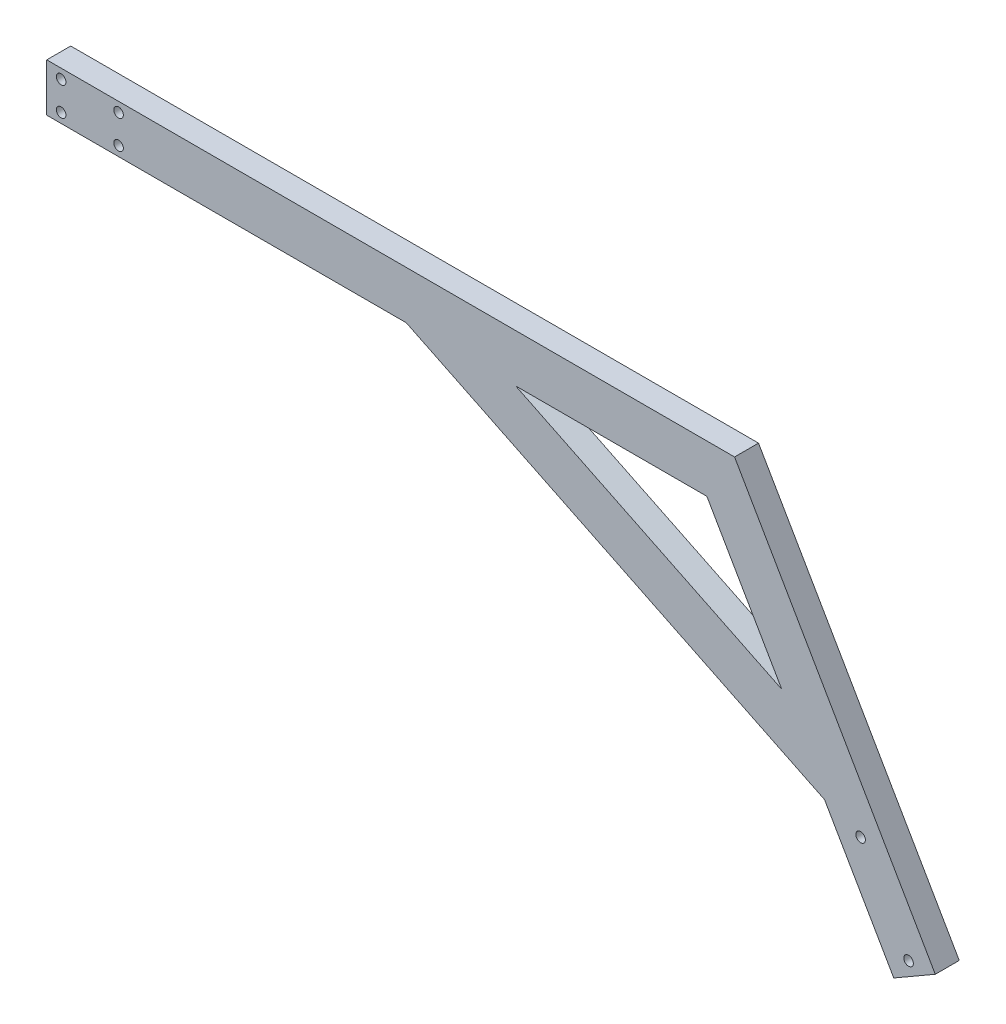
ISO-10303-21;
HEADER;
FILE_DESCRIPTION(('STEP AP214'),'2;1');
FILE_NAME('part.step','',(''),(''),'','','');
FILE_SCHEMA(('AUTOMOTIVE_DESIGN { 1 0 10303 214 1 1 1 1 }'));
ENDSEC;
DATA;
#1=APPLICATION_CONTEXT('core data for automotive mechanical design processes');
#2=APPLICATION_PROTOCOL_DEFINITION('international standard','automotive_design',2000,#1);
#3=PRODUCT_CONTEXT('',#1,'mechanical');
#4=PRODUCT('Part','Part','',(#3));
#5=PRODUCT_RELATED_PRODUCT_CATEGORY('part','',(#4));
#6=PRODUCT_DEFINITION_FORMATION('','',#4);
#7=PRODUCT_DEFINITION_CONTEXT('part definition',#1,'design');
#8=PRODUCT_DEFINITION('design','',#6,#7);
#9=PRODUCT_DEFINITION_SHAPE('','',#8);
#10=(LENGTH_UNIT() NAMED_UNIT(*) SI_UNIT(.MILLI.,.METRE.));
#11=(NAMED_UNIT(*) PLANE_ANGLE_UNIT() SI_UNIT($,.RADIAN.));
#12=(NAMED_UNIT(*) SI_UNIT($,.STERADIAN.) SOLID_ANGLE_UNIT());
#13=UNCERTAINTY_MEASURE_WITH_UNIT(LENGTH_MEASURE(1.E-05),#10,'distance_accuracy_value','');
#14=(GEOMETRIC_REPRESENTATION_CONTEXT(3) GLOBAL_UNCERTAINTY_ASSIGNED_CONTEXT((#13)) GLOBAL_UNIT_ASSIGNED_CONTEXT((#10,
#11,#12)) REPRESENTATION_CONTEXT('',''));
#15=CARTESIAN_POINT('',(0.,0.,0.));
#16=DIRECTION('',(0.,0.,1.));
#17=DIRECTION('',(1.,0.,0.));
#18=AXIS2_PLACEMENT_3D('',#15,#16,#17);
#19=CARTESIAN_POINT('',(0.,0.,-10.));
#20=DIRECTION('',(0.,1.,0.));
#21=DIRECTION('',(0.,0.,-1.));
#22=AXIS2_PLACEMENT_3D('',#19,#20,#21);
#23=PLANE('',#22);
#24=DIRECTION('',(0.,0.,1.));
#25=VECTOR('',#24,1.);
#26=CARTESIAN_POINT('',(150.,0.,-10.));
#27=LINE('',#26,#25);
#28=CARTESIAN_POINT('',(150.,0.,-10.));
#29=VERTEX_POINT('',#28);
#30=CARTESIAN_POINT('',(150.,0.,0.));
#31=VERTEX_POINT('',#30);
#32=EDGE_CURVE('E145',#29,#31,#27,.T.);
#33=ORIENTED_EDGE('',*,*,#32,.T.);
#34=DIRECTION('',(1.,0.,0.));
#35=VECTOR('',#34,1.);
#36=CARTESIAN_POINT('',(0.,0.,0.));
#37=LINE('',#36,#35);
#38=CARTESIAN_POINT('',(0.,0.,0.));
#39=VERTEX_POINT('',#38);
#40=EDGE_CURVE('E128',#39,#31,#37,.T.);
#41=ORIENTED_EDGE('',*,*,#40,.F.);
#42=DIRECTION('',(0.,0.,1.));
#43=VECTOR('',#42,1.);
#44=CARTESIAN_POINT('',(0.,0.,-10.));
#45=LINE('',#44,#43);
#46=CARTESIAN_POINT('',(0.,0.,-10.));
#47=VERTEX_POINT('',#46);
#48=EDGE_CURVE('E11',#47,#39,#45,.T.);
#49=ORIENTED_EDGE('',*,*,#48,.F.);
#50=DIRECTION('',(1.,0.,0.));
#51=VECTOR('',#50,1.);
#52=CARTESIAN_POINT('',(0.,0.,-10.));
#53=LINE('',#52,#51);
#54=EDGE_CURVE('E195',#47,#29,#53,.T.);
#55=ORIENTED_EDGE('',*,*,#54,.T.);
#56=EDGE_LOOP('',(#33,#41,#49,#55));
#57=FACE_BOUND('',#56,.T.);
#58=ADVANCED_FACE('F41',(#57),#23,.F.);
#59=DIRECTION('',(0.,0.,1.));
#60=VECTOR('',#59,1.);
#61=CARTESIAN_POINT('',(195.652685925849,0.,-10.));
#62=LINE('',#61,#60);
#63=CARTESIAN_POINT('',(195.652685925849,0.,-10.));
#64=VERTEX_POINT('',#63);
#65=CARTESIAN_POINT('',(195.652685925849,0.,0.));
#66=VERTEX_POINT('',#65);
#67=EDGE_CURVE('E151',#64,#66,#62,.T.);
#68=ORIENTED_EDGE('',*,*,#67,.F.);
#69=CARTESIAN_POINT('',(275.4,0.,-10.));
#70=VERTEX_POINT('',#69);
#71=EDGE_CURVE('E193',#64,#70,#53,.T.);
#72=ORIENTED_EDGE('',*,*,#71,.T.);
#73=DIRECTION('',(0.,0.,1.));
#74=VECTOR('',#73,1.);
#75=CARTESIAN_POINT('',(275.4,0.,-10.));
#76=LINE('',#75,#74);
#77=CARTESIAN_POINT('',(275.4,0.,0.));
#78=VERTEX_POINT('',#77);
#79=EDGE_CURVE('E49',#70,#78,#76,.T.);
#80=ORIENTED_EDGE('',*,*,#79,.T.);
#81=EDGE_CURVE('E212',#66,#78,#37,.T.);
#82=ORIENTED_EDGE('',*,*,#81,.F.);
#83=EDGE_LOOP('',(#68,#72,#80,#82));
#84=FACE_BOUND('',#83,.T.);
#85=ADVANCED_FACE('F233',(#84),#23,.F.);
#86=CARTESIAN_POINT('',(275.4,0.,-10.));
#87=DIRECTION('',(0.86602540378444,0.499999999999998,0.));
#88=DIRECTION('',(-0.499999999999998,0.86602540378444,0.));
#89=AXIS2_PLACEMENT_3D('',#86,#87,#88);
#90=PLANE('',#89);
#91=DIRECTION('',(0.,0.,1.));
#92=VECTOR('',#91,1.);
#93=CARTESIAN_POINT('',(324.498526901566,-85.0411431702995,-10.));
#94=LINE('',#93,#92);
#95=CARTESIAN_POINT('',(324.498526901566,-85.0411431702995,-10.));
#96=VERTEX_POINT('',#95);
#97=CARTESIAN_POINT('',(324.498526901566,-85.0411431702995,0.));
#98=VERTEX_POINT('',#97);
#99=EDGE_CURVE('E139',#96,#98,#94,.T.);
#100=ORIENTED_EDGE('',*,*,#99,.F.);
#101=DIRECTION('',(0.499999999999998,-0.86602540378444,0.));
#102=VECTOR('',#101,1.);
#103=CARTESIAN_POINT('',(275.4,0.,-10.));
#104=LINE('',#103,#102);
#105=CARTESIAN_POINT('',(353.366040361047,-135.0411431703,-10.));
#106=VERTEX_POINT('',#105);
#107=EDGE_CURVE('E197',#96,#106,#104,.T.);
#108=ORIENTED_EDGE('',*,*,#107,.T.);
#109=DIRECTION('',(0.,0.,1.));
#110=VECTOR('',#109,1.);
#111=CARTESIAN_POINT('',(353.366040361047,-135.0411431703,-10.));
#112=LINE('',#111,#110);
#113=CARTESIAN_POINT('',(353.366040361047,-135.0411431703,0.));
#114=VERTEX_POINT('',#113);
#115=EDGE_CURVE('E141',#106,#114,#112,.T.);
#116=ORIENTED_EDGE('',*,*,#115,.T.);
#117=DIRECTION('',(0.499999999999998,-0.86602540378444,0.));
#118=VECTOR('',#117,1.);
#119=CARTESIAN_POINT('',(275.4,0.,0.));
#120=LINE('',#119,#118);
#121=EDGE_CURVE('E125',#98,#114,#120,.T.);
#122=ORIENTED_EDGE('',*,*,#121,.F.);
#123=EDGE_LOOP('',(#100,#108,#116,#122));
#124=FACE_BOUND('',#123,.T.);
#125=ADVANCED_FACE('F137',(#124),#90,.F.);
#126=DIRECTION('',(0.,0.,1.));
#127=VECTOR('',#126,1.);
#128=CARTESIAN_POINT('',(306.623888719277,-54.0813616716643,-10.));
#129=LINE('',#128,#127);
#130=CARTESIAN_POINT('',(306.623888719277,-54.0813616716644,-10.));
#131=VERTEX_POINT('',#130);
#132=CARTESIAN_POINT('',(306.623888719277,-54.0813616716641,0.));
#133=VERTEX_POINT('',#132);
#134=EDGE_CURVE('E146',#131,#133,#129,.T.);
#135=ORIENTED_EDGE('',*,*,#134,.T.);
#136=EDGE_CURVE('E142',#78,#133,#120,.T.);
#137=ORIENTED_EDGE('',*,*,#136,.F.);
#138=ORIENTED_EDGE('',*,*,#79,.F.);
#139=EDGE_CURVE('E198',#70,#131,#104,.T.);
#140=ORIENTED_EDGE('',*,*,#139,.T.);
#141=EDGE_LOOP('',(#135,#137,#138,#140));
#142=FACE_BOUND('',#141,.T.);
#143=ADVANCED_FACE('F236',(#142),#90,.F.);
#144=CARTESIAN_POINT('',(0.,0.,-10.));
#145=DIRECTION('',(0.,0.,-1.));
#146=DIRECTION('',(1.,0.,0.));
#147=AXIS2_PLACEMENT_3D('',#144,#145,#146);
#148=PLANE('',#147);
#149=ORIENTED_EDGE('',*,*,#54,.F.);
#150=DIRECTION('',(0.,-1.,0.));
#151=VECTOR('',#150,1.);
#152=CARTESIAN_POINT('',(0.,20.,-10.));
#153=LINE('',#152,#151);
#154=CARTESIAN_POINT('',(0.,20.,-10.));
#155=VERTEX_POINT('',#154);
#156=EDGE_CURVE('E191',#155,#47,#153,.T.);
#157=ORIENTED_EDGE('',*,*,#156,.F.);
#158=DIRECTION('',(-1.,0.,0.));
#159=VECTOR('',#158,1.);
#160=CARTESIAN_POINT('',(286.947005383792,20.,-10.));
#161=LINE('',#160,#159);
#162=CARTESIAN_POINT('',(286.947005383792,20.,-10.));
#163=VERTEX_POINT('',#162);
#164=EDGE_CURVE('E207',#163,#155,#161,.T.);
#165=ORIENTED_EDGE('',*,*,#164,.F.);
#166=DIRECTION('',(-0.499999999999999,0.866025403784439,0.));
#167=VECTOR('',#166,1.);
#168=CARTESIAN_POINT('',(370.686548436736,-125.0411431703,-10.));
#169=LINE('',#168,#167);
#170=CARTESIAN_POINT('',(370.686548436736,-125.0411431703,-10.));
#171=VERTEX_POINT('',#170);
#172=EDGE_CURVE('E204',#171,#163,#169,.T.);
#173=ORIENTED_EDGE('',*,*,#172,.F.);
#174=DIRECTION('',(0.86602540378444,0.499999999999998,0.));
#175=VECTOR('',#174,1.);
#176=CARTESIAN_POINT('',(353.366040361047,-135.0411431703,-10.));
#177=LINE('',#176,#175);
#178=EDGE_CURVE('E201',#106,#171,#177,.T.);
#179=ORIENTED_EDGE('',*,*,#178,.F.);
#180=ORIENTED_EDGE('',*,*,#107,.F.);
#181=DIRECTION('',(0.898930958092636,-0.438090324685053,0.));
#182=VECTOR('',#181,1.);
#183=CARTESIAN_POINT('',(150.,0.,-10.));
#184=LINE('',#183,#182);
#185=EDGE_CURVE('E64',#29,#96,#184,.T.);
#186=ORIENTED_EDGE('',*,*,#185,.F.);
#187=EDGE_LOOP('',(#149,#157,#165,#173,#179,#180,#186));
#188=FACE_BOUND('',#187,.T.);
#189=CARTESIAN_POINT('',(339.526294398891,-91.07,-10.));
#190=DIRECTION('',(0.,0.,1.));
#191=DIRECTION('',(1.,0.,0.));
#192=AXIS2_PLACEMENT_3D('',#189,#190,#191);
#193=CIRCLE('',#192,2.);
#194=CARTESIAN_POINT('',(341.526294398891,-91.07,-10.));
#195=VERTEX_POINT('',#194);
#196=EDGE_CURVE('E161',#195,#195,#193,.T.);
#197=ORIENTED_EDGE('',*,*,#196,.T.);
#198=EDGE_LOOP('',(#197));
#199=FACE_BOUND('',#198,.T.);
#200=CARTESIAN_POINT('',(29.96,4.02,-10.));
#201=DIRECTION('',(0.,0.,1.));
#202=DIRECTION('',(1.,0.,0.));
#203=AXIS2_PLACEMENT_3D('',#200,#201,#202);
#204=CIRCLE('',#203,2.00000000000001);
#205=CARTESIAN_POINT('',(31.96,4.02,-10.));
#206=VERTEX_POINT('',#205);
#207=EDGE_CURVE('E173',#206,#206,#204,.T.);
#208=ORIENTED_EDGE('',*,*,#207,.T.);
#209=EDGE_LOOP('',(#208));
#210=FACE_BOUND('',#209,.T.);
#211=CARTESIAN_POINT('',(6.,15.98,-10.));
#212=DIRECTION('',(0.,0.,1.));
#213=DIRECTION('',(1.,0.,0.));
#214=AXIS2_PLACEMENT_3D('',#211,#212,#213);
#215=CIRCLE('',#214,2.);
#216=CARTESIAN_POINT('',(8.,15.98,-10.));
#217=VERTEX_POINT('',#216);
#218=EDGE_CURVE('E185',#217,#217,#215,.T.);
#219=ORIENTED_EDGE('',*,*,#218,.T.);
#220=EDGE_LOOP('',(#219));
#221=FACE_BOUND('',#220,.T.);
#222=DIRECTION('',(-0.898930958092636,0.438090324685053,0.));
#223=VECTOR('',#222,1.);
#224=CARTESIAN_POINT('',(195.652685925849,0.,-10.));
#225=LINE('',#224,#223);
#226=EDGE_CURVE('E56',#131,#64,#225,.T.);
#227=ORIENTED_EDGE('',*,*,#226,.F.);
#228=ORIENTED_EDGE('',*,*,#139,.F.);
#229=ORIENTED_EDGE('',*,*,#71,.F.);
#230=EDGE_LOOP('',(#227,#228,#229));
#231=FACE_BOUND('',#230,.T.);
#232=CARTESIAN_POINT('',(29.96,15.98,-10.));
#233=DIRECTION('',(0.,0.,1.));
#234=DIRECTION('',(1.,0.,0.));
#235=AXIS2_PLACEMENT_3D('',#232,#233,#234);
#236=CIRCLE('',#235,2.00000000000001);
#237=CARTESIAN_POINT('',(31.96,15.98,-10.));
#238=VERTEX_POINT('',#237);
#239=EDGE_CURVE('E179',#238,#238,#236,.T.);
#240=ORIENTED_EDGE('',*,*,#239,.T.);
#241=EDGE_LOOP('',(#240));
#242=FACE_BOUND('',#241,.T.);
#243=CARTESIAN_POINT('',(6.,4.02,-10.));
#244=DIRECTION('',(0.,0.,1.));
#245=DIRECTION('',(1.,0.,0.));
#246=AXIS2_PLACEMENT_3D('',#243,#244,#245);
#247=CIRCLE('',#246,2.);
#248=CARTESIAN_POINT('',(8.,4.02,-10.));
#249=VERTEX_POINT('',#248);
#250=EDGE_CURVE('E167',#249,#249,#247,.T.);
#251=ORIENTED_EDGE('',*,*,#250,.T.);
#252=EDGE_LOOP('',(#251));
#253=FACE_BOUND('',#252,.T.);
#254=CARTESIAN_POINT('',(359.526294398891,-125.711016151378,-10.));
#255=DIRECTION('',(0.,0.,1.));
#256=DIRECTION('',(1.,0.,0.));
#257=AXIS2_PLACEMENT_3D('',#254,#255,#256);
#258=CIRCLE('',#257,1.99999999999971);
#259=CARTESIAN_POINT('',(361.526294398891,-125.711016151378,-10.));
#260=VERTEX_POINT('',#259);
#261=EDGE_CURVE('E155',#260,#260,#258,.T.);
#262=ORIENTED_EDGE('',*,*,#261,.T.);
#263=EDGE_LOOP('',(#262));
#264=FACE_BOUND('',#263,.T.);
#265=ADVANCED_FACE('F272',(#188,#199,#210,#221,#231,#242,#253,#264),#148,.T.);
#266=CARTESIAN_POINT('',(0.,0.,0.));
#267=DIRECTION('',(0.,0.,-1.));
#268=DIRECTION('',(1.,0.,0.));
#269=AXIS2_PLACEMENT_3D('',#266,#267,#268);
#270=PLANE('',#269);
#271=DIRECTION('',(0.898930958092636,-0.438090324685053,0.));
#272=VECTOR('',#271,1.);
#273=CARTESIAN_POINT('',(150.,0.,0.));
#274=LINE('',#273,#272);
#275=EDGE_CURVE('E120',#31,#98,#274,.T.);
#276=ORIENTED_EDGE('',*,*,#275,.T.);
#277=ORIENTED_EDGE('',*,*,#121,.T.);
#278=DIRECTION('',(0.86602540378444,0.499999999999998,0.));
#279=VECTOR('',#278,1.);
#280=CARTESIAN_POINT('',(353.366040361047,-135.0411431703,0.));
#281=LINE('',#280,#279);
#282=CARTESIAN_POINT('',(370.686548436736,-125.0411431703,0.));
#283=VERTEX_POINT('',#282);
#284=EDGE_CURVE('E215',#114,#283,#281,.T.);
#285=ORIENTED_EDGE('',*,*,#284,.T.);
#286=DIRECTION('',(-0.499999999999999,0.866025403784439,0.));
#287=VECTOR('',#286,1.);
#288=CARTESIAN_POINT('',(370.686548436736,-125.0411431703,0.));
#289=LINE('',#288,#287);
#290=CARTESIAN_POINT('',(286.947005383792,20.,0.));
#291=VERTEX_POINT('',#290);
#292=EDGE_CURVE('E217',#283,#291,#289,.T.);
#293=ORIENTED_EDGE('',*,*,#292,.T.);
#294=DIRECTION('',(-1.,0.,0.));
#295=VECTOR('',#294,1.);
#296=CARTESIAN_POINT('',(286.947005383792,20.,0.));
#297=LINE('',#296,#295);
#298=CARTESIAN_POINT('',(0.,20.,0.));
#299=VERTEX_POINT('',#298);
#300=EDGE_CURVE('E194',#291,#299,#297,.T.);
#301=ORIENTED_EDGE('',*,*,#300,.T.);
#302=DIRECTION('',(0.,-1.,0.));
#303=VECTOR('',#302,1.);
#304=CARTESIAN_POINT('',(0.,20.,0.));
#305=LINE('',#304,#303);
#306=EDGE_CURVE('E188',#299,#39,#305,.T.);
#307=ORIENTED_EDGE('',*,*,#306,.T.);
#308=ORIENTED_EDGE('',*,*,#40,.T.);
#309=EDGE_LOOP('',(#276,#277,#285,#293,#301,#307,#308));
#310=FACE_BOUND('',#309,.T.);
#311=ORIENTED_EDGE('',*,*,#81,.T.);
#312=ORIENTED_EDGE('',*,*,#136,.T.);
#313=DIRECTION('',(-0.898930958092636,0.438090324685053,0.));
#314=VECTOR('',#313,1.);
#315=CARTESIAN_POINT('',(195.652685925849,0.,0.));
#316=LINE('',#315,#314);
#317=EDGE_CURVE('E133',#133,#66,#316,.T.);
#318=ORIENTED_EDGE('',*,*,#317,.T.);
#319=EDGE_LOOP('',(#311,#312,#318));
#320=FACE_BOUND('',#319,.T.);
#321=CARTESIAN_POINT('',(6.,15.98,0.));
#322=DIRECTION('',(0.,0.,1.));
#323=DIRECTION('',(1.,0.,0.));
#324=AXIS2_PLACEMENT_3D('',#321,#322,#323);
#325=CIRCLE('',#324,2.);
#326=CARTESIAN_POINT('',(8.,15.98,0.));
#327=VERTEX_POINT('',#326);
#328=EDGE_CURVE('E182',#327,#327,#325,.T.);
#329=ORIENTED_EDGE('',*,*,#328,.F.);
#330=EDGE_LOOP('',(#329));
#331=FACE_BOUND('',#330,.T.);
#332=CARTESIAN_POINT('',(29.96,15.98,0.));
#333=DIRECTION('',(0.,0.,1.));
#334=DIRECTION('',(1.,0.,0.));
#335=AXIS2_PLACEMENT_3D('',#332,#333,#334);
#336=CIRCLE('',#335,2.00000000000001);
#337=CARTESIAN_POINT('',(31.96,15.98,0.));
#338=VERTEX_POINT('',#337);
#339=EDGE_CURVE('E176',#338,#338,#336,.T.);
#340=ORIENTED_EDGE('',*,*,#339,.F.);
#341=EDGE_LOOP('',(#340));
#342=FACE_BOUND('',#341,.T.);
#343=CARTESIAN_POINT('',(29.96,4.02,0.));
#344=DIRECTION('',(0.,0.,1.));
#345=DIRECTION('',(1.,0.,0.));
#346=AXIS2_PLACEMENT_3D('',#343,#344,#345);
#347=CIRCLE('',#346,2.00000000000001);
#348=CARTESIAN_POINT('',(31.96,4.02,0.));
#349=VERTEX_POINT('',#348);
#350=EDGE_CURVE('E170',#349,#349,#347,.T.);
#351=ORIENTED_EDGE('',*,*,#350,.F.);
#352=EDGE_LOOP('',(#351));
#353=FACE_BOUND('',#352,.T.);
#354=CARTESIAN_POINT('',(6.,4.02,0.));
#355=DIRECTION('',(0.,0.,1.));
#356=DIRECTION('',(1.,0.,0.));
#357=AXIS2_PLACEMENT_3D('',#354,#355,#356);
#358=CIRCLE('',#357,2.);
#359=CARTESIAN_POINT('',(8.,4.02,0.));
#360=VERTEX_POINT('',#359);
#361=EDGE_CURVE('E164',#360,#360,#358,.T.);
#362=ORIENTED_EDGE('',*,*,#361,.F.);
#363=EDGE_LOOP('',(#362));
#364=FACE_BOUND('',#363,.T.);
#365=CARTESIAN_POINT('',(339.526294398891,-91.07,0.));
#366=DIRECTION('',(0.,0.,1.));
#367=DIRECTION('',(1.,0.,0.));
#368=AXIS2_PLACEMENT_3D('',#365,#366,#367);
#369=CIRCLE('',#368,2.);
#370=CARTESIAN_POINT('',(341.526294398891,-91.07,0.));
#371=VERTEX_POINT('',#370);
#372=EDGE_CURVE('E158',#371,#371,#369,.T.);
#373=ORIENTED_EDGE('',*,*,#372,.F.);
#374=EDGE_LOOP('',(#373));
#375=FACE_BOUND('',#374,.T.);
#376=CARTESIAN_POINT('',(359.526294398891,-125.711016151378,0.));
#377=DIRECTION('',(0.,0.,1.));
#378=DIRECTION('',(1.,0.,0.));
#379=AXIS2_PLACEMENT_3D('',#376,#377,#378);
#380=CIRCLE('',#379,1.99999999999971);
#381=CARTESIAN_POINT('',(361.526294398891,-125.711016151378,0.));
#382=VERTEX_POINT('',#381);
#383=EDGE_CURVE('E148',#382,#382,#380,.T.);
#384=ORIENTED_EDGE('',*,*,#383,.F.);
#385=EDGE_LOOP('',(#384));
#386=FACE_BOUND('',#385,.T.);
#387=ADVANCED_FACE('F122',(#310,#320,#331,#342,#353,#364,#375,#386),#270,.F.);
#388=CARTESIAN_POINT('',(0.,20.,-10.));
#389=DIRECTION('',(1.,0.,0.));
#390=DIRECTION('',(0.,0.,1.));
#391=AXIS2_PLACEMENT_3D('',#388,#389,#390);
#392=PLANE('',#391);
#393=ORIENTED_EDGE('',*,*,#306,.F.);
#394=DIRECTION('',(0.,0.,1.));
#395=VECTOR('',#394,1.);
#396=CARTESIAN_POINT('',(0.,20.,-10.));
#397=LINE('',#396,#395);
#398=EDGE_CURVE('E210',#155,#299,#397,.T.);
#399=ORIENTED_EDGE('',*,*,#398,.F.);
#400=ORIENTED_EDGE('',*,*,#156,.T.);
#401=ORIENTED_EDGE('',*,*,#48,.T.);
#402=EDGE_LOOP('',(#393,#399,#400,#401));
#403=FACE_BOUND('',#402,.T.);
#404=ADVANCED_FACE('F43',(#403),#392,.F.);
#405=CARTESIAN_POINT('',(353.366040361047,-135.0411431703,-10.));
#406=DIRECTION('',(-0.499999999999997,0.86602540378444,0.));
#407=DIRECTION('',(-0.86602540378444,-0.499999999999998,0.));
#408=AXIS2_PLACEMENT_3D('',#405,#406,#407);
#409=PLANE('',#408);
#410=ORIENTED_EDGE('',*,*,#284,.F.);
#411=ORIENTED_EDGE('',*,*,#115,.F.);
#412=ORIENTED_EDGE('',*,*,#178,.T.);
#413=DIRECTION('',(0.,0.,1.));
#414=VECTOR('',#413,1.);
#415=CARTESIAN_POINT('',(370.686548436736,-125.0411431703,-10.));
#416=LINE('',#415,#414);
#417=EDGE_CURVE('E225',#171,#283,#416,.T.);
#418=ORIENTED_EDGE('',*,*,#417,.T.);
#419=EDGE_LOOP('',(#410,#411,#412,#418));
#420=FACE_BOUND('',#419,.T.);
#421=ADVANCED_FACE('F257',(#420),#409,.F.);
#422=CARTESIAN_POINT('',(370.686548436736,-125.0411431703,-10.));
#423=DIRECTION('',(-0.866025403784439,-0.499999999999999,0.));
#424=DIRECTION('',(0.499999999999999,-0.866025403784439,0.));
#425=AXIS2_PLACEMENT_3D('',#422,#423,#424);
#426=PLANE('',#425);
#427=ORIENTED_EDGE('',*,*,#292,.F.);
#428=ORIENTED_EDGE('',*,*,#417,.F.);
#429=ORIENTED_EDGE('',*,*,#172,.T.);
#430=DIRECTION('',(0.,0.,1.));
#431=VECTOR('',#430,1.);
#432=CARTESIAN_POINT('',(286.947005383792,20.,-10.));
#433=LINE('',#432,#431);
#434=EDGE_CURVE('E223',#163,#291,#433,.T.);
#435=ORIENTED_EDGE('',*,*,#434,.T.);
#436=EDGE_LOOP('',(#427,#428,#429,#435));
#437=FACE_BOUND('',#436,.T.);
#438=ADVANCED_FACE('F260',(#437),#426,.F.);
#439=CARTESIAN_POINT('',(286.947005383792,20.,-10.));
#440=DIRECTION('',(0.,-1.,0.));
#441=DIRECTION('',(0.,0.,1.));
#442=AXIS2_PLACEMENT_3D('',#439,#440,#441);
#443=PLANE('',#442);
#444=ORIENTED_EDGE('',*,*,#300,.F.);
#445=ORIENTED_EDGE('',*,*,#434,.F.);
#446=ORIENTED_EDGE('',*,*,#164,.T.);
#447=ORIENTED_EDGE('',*,*,#398,.T.);
#448=EDGE_LOOP('',(#444,#445,#446,#447));
#449=FACE_BOUND('',#448,.T.);
#450=ADVANCED_FACE('F264',(#449),#443,.F.);
#451=CARTESIAN_POINT('',(6.,15.98,-10.));
#452=DIRECTION('',(0.,0.,1.));
#453=DIRECTION('',(-1.,0.,0.));
#454=AXIS2_PLACEMENT_3D('',#451,#452,#453);
#455=CYLINDRICAL_SURFACE('',#454,2.);
#456=ORIENTED_EDGE('',*,*,#218,.F.);
#457=EDGE_LOOP('',(#456));
#458=FACE_BOUND('',#457,.T.);
#459=ORIENTED_EDGE('',*,*,#328,.T.);
#460=EDGE_LOOP('',(#459));
#461=FACE_BOUND('',#460,.T.);
#462=ADVANCED_FACE('F268',(#458,#461),#455,.F.);
#463=CARTESIAN_POINT('',(29.96,15.98,-10.));
#464=DIRECTION('',(0.,0.,1.));
#465=DIRECTION('',(-1.,0.,0.));
#466=AXIS2_PLACEMENT_3D('',#463,#464,#465);
#467=CYLINDRICAL_SURFACE('',#466,2.00000000000001);
#468=ORIENTED_EDGE('',*,*,#239,.F.);
#469=EDGE_LOOP('',(#468));
#470=FACE_BOUND('',#469,.T.);
#471=ORIENTED_EDGE('',*,*,#339,.T.);
#472=EDGE_LOOP('',(#471));
#473=FACE_BOUND('',#472,.T.);
#474=ADVANCED_FACE('F277',(#470,#473),#467,.F.);
#475=CARTESIAN_POINT('',(29.96,4.02,-10.));
#476=DIRECTION('',(0.,0.,1.));
#477=DIRECTION('',(-1.,0.,0.));
#478=AXIS2_PLACEMENT_3D('',#475,#476,#477);
#479=CYLINDRICAL_SURFACE('',#478,2.00000000000001);
#480=ORIENTED_EDGE('',*,*,#207,.F.);
#481=EDGE_LOOP('',(#480));
#482=FACE_BOUND('',#481,.T.);
#483=ORIENTED_EDGE('',*,*,#350,.T.);
#484=EDGE_LOOP('',(#483));
#485=FACE_BOUND('',#484,.T.);
#486=ADVANCED_FACE('F281',(#482,#485),#479,.F.);
#487=CARTESIAN_POINT('',(6.,4.02,-10.));
#488=DIRECTION('',(0.,0.,1.));
#489=DIRECTION('',(-1.,0.,0.));
#490=AXIS2_PLACEMENT_3D('',#487,#488,#489);
#491=CYLINDRICAL_SURFACE('',#490,2.);
#492=ORIENTED_EDGE('',*,*,#250,.F.);
#493=EDGE_LOOP('',(#492));
#494=FACE_BOUND('',#493,.T.);
#495=ORIENTED_EDGE('',*,*,#361,.T.);
#496=EDGE_LOOP('',(#495));
#497=FACE_BOUND('',#496,.T.);
#498=ADVANCED_FACE('F285',(#494,#497),#491,.F.);
#499=CARTESIAN_POINT('',(339.526294398891,-91.07,-10.));
#500=DIRECTION('',(0.,0.,1.));
#501=DIRECTION('',(-1.,0.,0.));
#502=AXIS2_PLACEMENT_3D('',#499,#500,#501);
#503=CYLINDRICAL_SURFACE('',#502,2.);
#504=ORIENTED_EDGE('',*,*,#196,.F.);
#505=EDGE_LOOP('',(#504));
#506=FACE_BOUND('',#505,.T.);
#507=ORIENTED_EDGE('',*,*,#372,.T.);
#508=EDGE_LOOP('',(#507));
#509=FACE_BOUND('',#508,.T.);
#510=ADVANCED_FACE('F289',(#506,#509),#503,.F.);
#511=CARTESIAN_POINT('',(359.526294398891,-125.711016151378,-10.));
#512=DIRECTION('',(0.,0.,1.));
#513=DIRECTION('',(-1.,0.,0.));
#514=AXIS2_PLACEMENT_3D('',#511,#512,#513);
#515=CYLINDRICAL_SURFACE('',#514,1.99999999999971);
#516=ORIENTED_EDGE('',*,*,#261,.F.);
#517=EDGE_LOOP('',(#516));
#518=FACE_BOUND('',#517,.T.);
#519=ORIENTED_EDGE('',*,*,#383,.T.);
#520=EDGE_LOOP('',(#519));
#521=FACE_BOUND('',#520,.T.);
#522=ADVANCED_FACE('F247',(#518,#521),#515,.F.);
#523=CARTESIAN_POINT('',(150.,0.,-10.));
#524=DIRECTION('',(0.438090324685053,0.898930958092637,0.));
#525=DIRECTION('',(-0.898930958092636,0.438090324685053,0.));
#526=AXIS2_PLACEMENT_3D('',#523,#524,#525);
#527=PLANE('',#526);
#528=ORIENTED_EDGE('',*,*,#275,.F.);
#529=ORIENTED_EDGE('',*,*,#32,.F.);
#530=ORIENTED_EDGE('',*,*,#185,.T.);
#531=ORIENTED_EDGE('',*,*,#99,.T.);
#532=EDGE_LOOP('',(#528,#529,#530,#531));
#533=FACE_BOUND('',#532,.T.);
#534=ADVANCED_FACE('F144',(#533),#527,.F.);
#535=CARTESIAN_POINT('',(195.652685925849,0.,-10.));
#536=DIRECTION('',(-0.438090324685053,-0.898930958092637,0.));
#537=DIRECTION('',(0.898930958092636,-0.438090324685053,0.));
#538=AXIS2_PLACEMENT_3D('',#535,#536,#537);
#539=PLANE('',#538);
#540=ORIENTED_EDGE('',*,*,#317,.F.);
#541=ORIENTED_EDGE('',*,*,#134,.F.);
#542=ORIENTED_EDGE('',*,*,#226,.T.);
#543=ORIENTED_EDGE('',*,*,#67,.T.);
#544=EDGE_LOOP('',(#540,#541,#542,#543));
#545=FACE_BOUND('',#544,.T.);
#546=ADVANCED_FACE('F241',(#545),#539,.F.);
#547=CLOSED_SHELL('',(#58,#85,#125,#143,#265,#387,#404,#421,#438,#450,#462,#474,#486,#498,#510,
#522,#534,#546));
#548=MANIFOLD_SOLID_BREP('B2',#547);
#549=ADVANCED_BREP_SHAPE_REPRESENTATION('',(#18,#548),#14);
#550=SHAPE_DEFINITION_REPRESENTATION(#9,#549);
ENDSEC;
END-ISO-10303-21;
